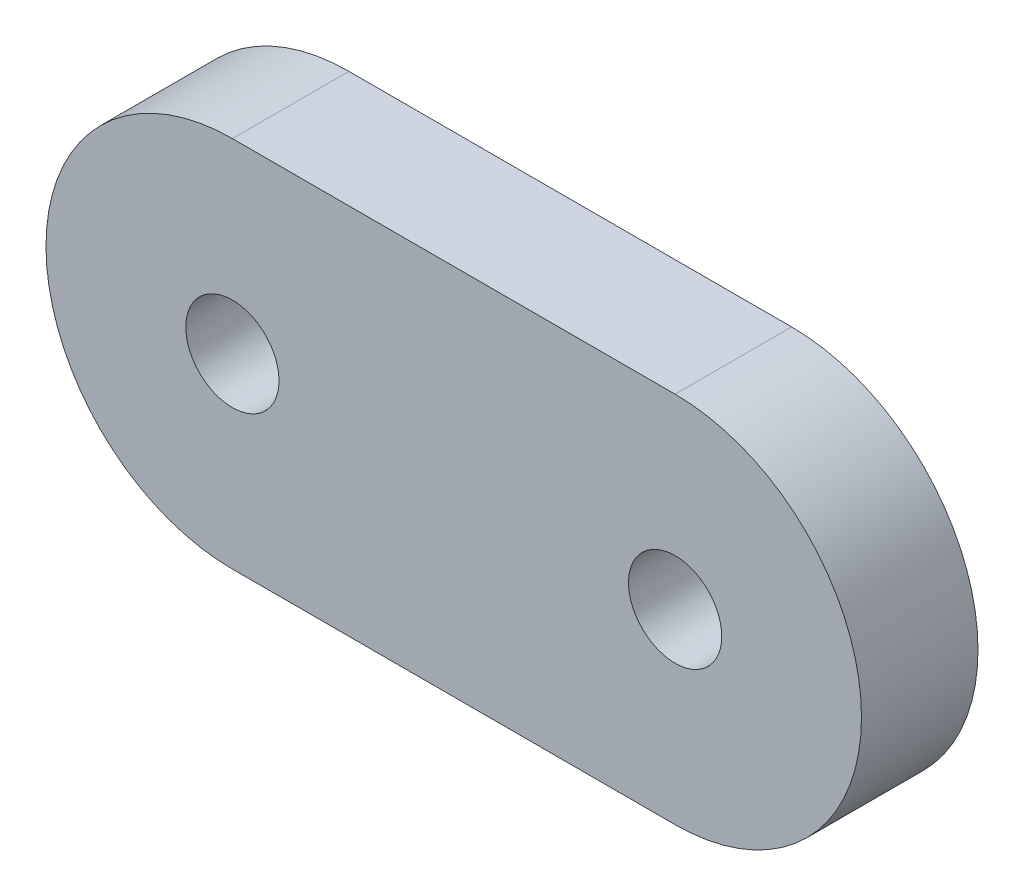
ISO-10303-21;
HEADER;
FILE_DESCRIPTION(('STEP AP214'),'2;1');
FILE_NAME('part.step','',(''),(''),'','','');
FILE_SCHEMA(('AUTOMOTIVE_DESIGN { 1 0 10303 214 1 1 1 1 }'));
ENDSEC;
DATA;
#1=APPLICATION_CONTEXT('core data for automotive mechanical design processes');
#2=APPLICATION_PROTOCOL_DEFINITION('international standard','automotive_design',2000,#1);
#3=PRODUCT_CONTEXT('',#1,'mechanical');
#4=PRODUCT('Part','Part','',(#3));
#5=PRODUCT_RELATED_PRODUCT_CATEGORY('part','',(#4));
#6=PRODUCT_DEFINITION_FORMATION('','',#4);
#7=PRODUCT_DEFINITION_CONTEXT('part definition',#1,'design');
#8=PRODUCT_DEFINITION('design','',#6,#7);
#9=PRODUCT_DEFINITION_SHAPE('','',#8);
#10=(LENGTH_UNIT() NAMED_UNIT(*) SI_UNIT(.MILLI.,.METRE.));
#11=(NAMED_UNIT(*) PLANE_ANGLE_UNIT() SI_UNIT($,.RADIAN.));
#12=(NAMED_UNIT(*) SI_UNIT($,.STERADIAN.) SOLID_ANGLE_UNIT());
#13=UNCERTAINTY_MEASURE_WITH_UNIT(LENGTH_MEASURE(1.E-05),#10,'distance_accuracy_value','');
#14=(GEOMETRIC_REPRESENTATION_CONTEXT(3) GLOBAL_UNCERTAINTY_ASSIGNED_CONTEXT((#13)) GLOBAL_UNIT_ASSIGNED_CONTEXT((#10,
#11,#12)) REPRESENTATION_CONTEXT('',''));
#15=CARTESIAN_POINT('',(0.,0.,0.));
#16=DIRECTION('',(0.,0.,1.));
#17=DIRECTION('',(1.,0.,0.));
#18=AXIS2_PLACEMENT_3D('',#15,#16,#17);
#19=CARTESIAN_POINT('',(0.,0.,6.35));
#20=DIRECTION('',(0.,0.,1.));
#21=DIRECTION('',(1.,0.,0.));
#22=AXIS2_PLACEMENT_3D('',#19,#20,#21);
#23=PLANE('',#22);
#24=CARTESIAN_POINT('',(0.,0.,6.35));
#25=DIRECTION('',(0.,0.,1.));
#26=DIRECTION('',(1.,0.,0.));
#27=AXIS2_PLACEMENT_3D('',#24,#25,#26);
#28=CIRCLE('',#27,2.54);
#29=CARTESIAN_POINT('',(2.54,0.,6.35));
#30=VERTEX_POINT('',#29);
#31=EDGE_CURVE('E101',#30,#30,#28,.T.);
#32=ORIENTED_EDGE('',*,*,#31,.F.);
#33=EDGE_LOOP('',(#32));
#34=FACE_BOUND('',#33,.T.);
#35=CARTESIAN_POINT('',(0.,0.,6.35));
#36=DIRECTION('',(0.,0.,1.));
#37=DIRECTION('',(1.,0.,0.));
#38=AXIS2_PLACEMENT_3D('',#35,#36,#37);
#39=CIRCLE('',#38,10.16);
#40=CARTESIAN_POINT('',(0.,10.16,6.35));
#41=VERTEX_POINT('',#40);
#42=CARTESIAN_POINT('',(0.,-10.16,6.35));
#43=VERTEX_POINT('',#42);
#44=EDGE_CURVE('E86',#41,#43,#39,.T.);
#45=ORIENTED_EDGE('',*,*,#44,.T.);
#46=DIRECTION('',(1.,0.,0.));
#47=VECTOR('',#46,1.);
#48=CARTESIAN_POINT('',(0.,-10.16,6.35));
#49=LINE('',#48,#47);
#50=CARTESIAN_POINT('',(24.13,-10.16,6.35));
#51=VERTEX_POINT('',#50);
#52=EDGE_CURVE('E81',#43,#51,#49,.T.);
#53=ORIENTED_EDGE('',*,*,#52,.T.);
#54=CARTESIAN_POINT('',(24.13,0.,6.35));
#55=DIRECTION('',(0.,0.,1.));
#56=DIRECTION('',(1.,0.,0.));
#57=AXIS2_PLACEMENT_3D('',#54,#55,#56);
#58=CIRCLE('',#57,10.16);
#59=CARTESIAN_POINT('',(24.13,10.16,6.35));
#60=VERTEX_POINT('',#59);
#61=EDGE_CURVE('E84',#51,#60,#58,.T.);
#62=ORIENTED_EDGE('',*,*,#61,.T.);
#63=DIRECTION('',(-1.,0.,0.));
#64=VECTOR('',#63,1.);
#65=CARTESIAN_POINT('',(0.,10.16,6.35));
#66=LINE('',#65,#64);
#67=EDGE_CURVE('E51',#60,#41,#66,.T.);
#68=ORIENTED_EDGE('',*,*,#67,.T.);
#69=EDGE_LOOP('',(#45,#53,#62,#68));
#70=FACE_BOUND('',#69,.T.);
#71=CARTESIAN_POINT('',(24.13,0.,6.35));
#72=DIRECTION('',(0.,0.,1.));
#73=DIRECTION('',(1.,0.,0.));
#74=AXIS2_PLACEMENT_3D('',#71,#72,#73);
#75=CIRCLE('',#74,2.54);
#76=CARTESIAN_POINT('',(26.67,0.,6.35));
#77=VERTEX_POINT('',#76);
#78=EDGE_CURVE('E116',#77,#77,#75,.T.);
#79=ORIENTED_EDGE('',*,*,#78,.F.);
#80=EDGE_LOOP('',(#79));
#81=FACE_BOUND('',#80,.T.);
#82=ADVANCED_FACE('F34',(#34,#70,#81),#23,.T.);
#83=CARTESIAN_POINT('',(0.,0.,0.));
#84=DIRECTION('',(0.,0.,1.));
#85=DIRECTION('',(1.,0.,0.));
#86=AXIS2_PLACEMENT_3D('',#83,#84,#85);
#87=PLANE('',#86);
#88=CARTESIAN_POINT('',(0.,0.,0.));
#89=DIRECTION('',(0.,0.,1.));
#90=DIRECTION('',(1.,0.,0.));
#91=AXIS2_PLACEMENT_3D('',#88,#89,#90);
#92=CIRCLE('',#91,10.16);
#93=CARTESIAN_POINT('',(0.,10.16,0.));
#94=VERTEX_POINT('',#93);
#95=CARTESIAN_POINT('',(0.,-10.16,0.));
#96=VERTEX_POINT('',#95);
#97=EDGE_CURVE('E98',#94,#96,#92,.T.);
#98=ORIENTED_EDGE('',*,*,#97,.F.);
#99=DIRECTION('',(-1.,0.,0.));
#100=VECTOR('',#99,1.);
#101=CARTESIAN_POINT('',(0.,10.16,0.));
#102=LINE('',#101,#100);
#103=CARTESIAN_POINT('',(24.13,10.16,0.));
#104=VERTEX_POINT('',#103);
#105=EDGE_CURVE('E74',#104,#94,#102,.T.);
#106=ORIENTED_EDGE('',*,*,#105,.F.);
#107=CARTESIAN_POINT('',(24.13,0.,0.));
#108=DIRECTION('',(0.,0.,1.));
#109=DIRECTION('',(1.,0.,0.));
#110=AXIS2_PLACEMENT_3D('',#107,#108,#109);
#111=CIRCLE('',#110,10.16);
#112=CARTESIAN_POINT('',(24.13,-10.16,0.));
#113=VERTEX_POINT('',#112);
#114=EDGE_CURVE('E68',#113,#104,#111,.T.);
#115=ORIENTED_EDGE('',*,*,#114,.F.);
#116=DIRECTION('',(1.,0.,0.));
#117=VECTOR('',#116,1.);
#118=CARTESIAN_POINT('',(0.,-10.16,0.));
#119=LINE('',#118,#117);
#120=EDGE_CURVE('E90',#96,#113,#119,.T.);
#121=ORIENTED_EDGE('',*,*,#120,.F.);
#122=EDGE_LOOP('',(#98,#106,#115,#121));
#123=FACE_BOUND('',#122,.T.);
#124=CARTESIAN_POINT('',(0.,0.,0.));
#125=DIRECTION('',(0.,0.,1.));
#126=DIRECTION('',(1.,0.,0.));
#127=AXIS2_PLACEMENT_3D('',#124,#125,#126);
#128=CIRCLE('',#127,2.54);
#129=CARTESIAN_POINT('',(2.54,0.,0.));
#130=VERTEX_POINT('',#129);
#131=EDGE_CURVE('E113',#130,#130,#128,.T.);
#132=ORIENTED_EDGE('',*,*,#131,.T.);
#133=EDGE_LOOP('',(#132));
#134=FACE_BOUND('',#133,.T.);
#135=CARTESIAN_POINT('',(24.13,0.,0.));
#136=DIRECTION('',(0.,0.,1.));
#137=DIRECTION('',(1.,0.,0.));
#138=AXIS2_PLACEMENT_3D('',#135,#136,#137);
#139=CIRCLE('',#138,2.54);
#140=CARTESIAN_POINT('',(26.67,0.,0.));
#141=VERTEX_POINT('',#140);
#142=EDGE_CURVE('E119',#141,#141,#139,.T.);
#143=ORIENTED_EDGE('',*,*,#142,.T.);
#144=EDGE_LOOP('',(#143));
#145=FACE_BOUND('',#144,.T.);
#146=ADVANCED_FACE('F109',(#123,#134,#145),#87,.F.);
#147=CARTESIAN_POINT('',(0.,0.,6.35));
#148=DIRECTION('',(0.,0.,-1.));
#149=DIRECTION('',(-1.,0.,0.));
#150=AXIS2_PLACEMENT_3D('',#147,#148,#149);
#151=CYLINDRICAL_SURFACE('',#150,10.16);
#152=ORIENTED_EDGE('',*,*,#97,.T.);
#153=DIRECTION('',(0.,0.,-1.));
#154=VECTOR('',#153,1.);
#155=CARTESIAN_POINT('',(0.,-10.16,6.35));
#156=LINE('',#155,#154);
#157=EDGE_CURVE('E11',#43,#96,#156,.T.);
#158=ORIENTED_EDGE('',*,*,#157,.F.);
#159=ORIENTED_EDGE('',*,*,#44,.F.);
#160=DIRECTION('',(0.,0.,-1.));
#161=VECTOR('',#160,1.);
#162=CARTESIAN_POINT('',(0.,10.16,6.35));
#163=LINE('',#162,#161);
#164=EDGE_CURVE('E94',#41,#94,#163,.T.);
#165=ORIENTED_EDGE('',*,*,#164,.T.);
#166=EDGE_LOOP('',(#152,#158,#159,#165));
#167=FACE_BOUND('',#166,.T.);
#168=ADVANCED_FACE('F36',(#167),#151,.T.);
#169=CARTESIAN_POINT('',(0.,-10.16,6.35));
#170=DIRECTION('',(0.,1.,0.));
#171=DIRECTION('',(-1.,0.,0.));
#172=AXIS2_PLACEMENT_3D('',#169,#170,#171);
#173=PLANE('',#172);
#174=ORIENTED_EDGE('',*,*,#120,.T.);
#175=DIRECTION('',(0.,0.,-1.));
#176=VECTOR('',#175,1.);
#177=CARTESIAN_POINT('',(24.13,-10.16,6.35));
#178=LINE('',#177,#176);
#179=EDGE_CURVE('E43',#51,#113,#178,.T.);
#180=ORIENTED_EDGE('',*,*,#179,.F.);
#181=ORIENTED_EDGE('',*,*,#52,.F.);
#182=ORIENTED_EDGE('',*,*,#157,.T.);
#183=EDGE_LOOP('',(#174,#180,#181,#182));
#184=FACE_BOUND('',#183,.T.);
#185=ADVANCED_FACE('F89',(#184),#173,.F.);
#186=CARTESIAN_POINT('',(24.13,0.,6.35));
#187=DIRECTION('',(0.,0.,-1.));
#188=DIRECTION('',(-1.,0.,0.));
#189=AXIS2_PLACEMENT_3D('',#186,#187,#188);
#190=CYLINDRICAL_SURFACE('',#189,10.16);
#191=ORIENTED_EDGE('',*,*,#114,.T.);
#192=DIRECTION('',(0.,0.,-1.));
#193=VECTOR('',#192,1.);
#194=CARTESIAN_POINT('',(24.13,10.16,6.35));
#195=LINE('',#194,#193);
#196=EDGE_CURVE('E91',#60,#104,#195,.T.);
#197=ORIENTED_EDGE('',*,*,#196,.F.);
#198=ORIENTED_EDGE('',*,*,#61,.F.);
#199=ORIENTED_EDGE('',*,*,#179,.T.);
#200=EDGE_LOOP('',(#191,#197,#198,#199));
#201=FACE_BOUND('',#200,.T.);
#202=ADVANCED_FACE('F92',(#201),#190,.T.);
#203=CARTESIAN_POINT('',(0.,10.16,6.35));
#204=DIRECTION('',(0.,-1.,0.));
#205=DIRECTION('',(1.,0.,0.));
#206=AXIS2_PLACEMENT_3D('',#203,#204,#205);
#207=PLANE('',#206);
#208=ORIENTED_EDGE('',*,*,#105,.T.);
#209=ORIENTED_EDGE('',*,*,#164,.F.);
#210=ORIENTED_EDGE('',*,*,#67,.F.);
#211=ORIENTED_EDGE('',*,*,#196,.T.);
#212=EDGE_LOOP('',(#208,#209,#210,#211));
#213=FACE_BOUND('',#212,.T.);
#214=ADVANCED_FACE('F106',(#213),#207,.F.);
#215=CARTESIAN_POINT('',(0.,0.,6.35));
#216=DIRECTION('',(0.,0.,-1.));
#217=DIRECTION('',(-1.,0.,0.));
#218=AXIS2_PLACEMENT_3D('',#215,#216,#217);
#219=CYLINDRICAL_SURFACE('',#218,2.54);
#220=ORIENTED_EDGE('',*,*,#31,.T.);
#221=EDGE_LOOP('',(#220));
#222=FACE_BOUND('',#221,.T.);
#223=ORIENTED_EDGE('',*,*,#131,.F.);
#224=EDGE_LOOP('',(#223));
#225=FACE_BOUND('',#224,.T.);
#226=ADVANCED_FACE('F136',(#222,#225),#219,.F.);
#227=CARTESIAN_POINT('',(24.13,0.,6.35));
#228=DIRECTION('',(0.,0.,-1.));
#229=DIRECTION('',(-1.,0.,0.));
#230=AXIS2_PLACEMENT_3D('',#227,#228,#229);
#231=CYLINDRICAL_SURFACE('',#230,2.54);
#232=ORIENTED_EDGE('',*,*,#78,.T.);
#233=EDGE_LOOP('',(#232));
#234=FACE_BOUND('',#233,.T.);
#235=ORIENTED_EDGE('',*,*,#142,.F.);
#236=EDGE_LOOP('',(#235));
#237=FACE_BOUND('',#236,.T.);
#238=ADVANCED_FACE('F125',(#234,#237),#231,.F.);
#239=CLOSED_SHELL('',(#82,#146,#168,#185,#202,#214,#226,#238));
#240=MANIFOLD_SOLID_BREP('B2',#239);
#241=ADVANCED_BREP_SHAPE_REPRESENTATION('',(#18,#240),#14);
#242=SHAPE_DEFINITION_REPRESENTATION(#9,#241);
ENDSEC;
END-ISO-10303-21;
